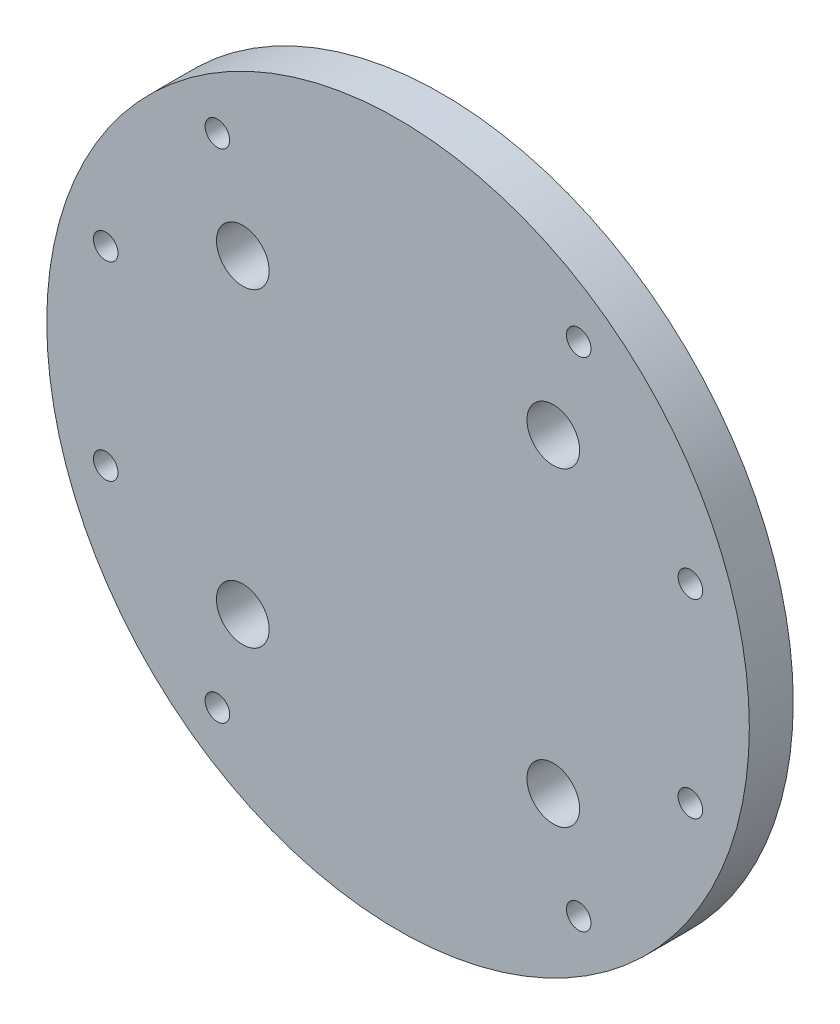
ISO-10303-21;
HEADER;
FILE_DESCRIPTION(('STEP AP214'),'2;1');
FILE_NAME('part.step','',(''),(''),'','','');
FILE_SCHEMA(('AUTOMOTIVE_DESIGN { 1 0 10303 214 1 1 1 1 }'));
ENDSEC;
DATA;
#1=APPLICATION_CONTEXT('core data for automotive mechanical design processes');
#2=APPLICATION_PROTOCOL_DEFINITION('international standard','automotive_design',2000,#1);
#3=PRODUCT_CONTEXT('',#1,'mechanical');
#4=PRODUCT('Part','Part','',(#3));
#5=PRODUCT_RELATED_PRODUCT_CATEGORY('part','',(#4));
#6=PRODUCT_DEFINITION_FORMATION('','',#4);
#7=PRODUCT_DEFINITION_CONTEXT('part definition',#1,'design');
#8=PRODUCT_DEFINITION('design','',#6,#7);
#9=PRODUCT_DEFINITION_SHAPE('','',#8);
#10=(LENGTH_UNIT() NAMED_UNIT(*) SI_UNIT(.MILLI.,.METRE.));
#11=(NAMED_UNIT(*) PLANE_ANGLE_UNIT() SI_UNIT($,.RADIAN.));
#12=(NAMED_UNIT(*) SI_UNIT($,.STERADIAN.) SOLID_ANGLE_UNIT());
#13=UNCERTAINTY_MEASURE_WITH_UNIT(LENGTH_MEASURE(1.E-05),#10,'distance_accuracy_value','');
#14=(GEOMETRIC_REPRESENTATION_CONTEXT(3) GLOBAL_UNCERTAINTY_ASSIGNED_CONTEXT((#13)) GLOBAL_UNIT_ASSIGNED_CONTEXT((#10,
#11,#12)) REPRESENTATION_CONTEXT('',''));
#15=CARTESIAN_POINT('',(0.,0.,0.));
#16=DIRECTION('',(0.,0.,1.));
#17=DIRECTION('',(1.,0.,0.));
#18=AXIS2_PLACEMENT_3D('',#15,#16,#17);
#19=CARTESIAN_POINT('',(0.,0.,5.));
#20=DIRECTION('',(0.,0.,-1.));
#21=DIRECTION('',(-1.,0.,0.));
#22=AXIS2_PLACEMENT_3D('',#19,#20,#21);
#23=CYLINDRICAL_SURFACE('',#22,40.);
#24=CARTESIAN_POINT('',(0.,0.,5.));
#25=DIRECTION('',(0.,0.,1.));
#26=DIRECTION('',(1.,0.,0.));
#27=AXIS2_PLACEMENT_3D('',#24,#25,#26);
#28=CIRCLE('',#27,40.);
#29=CARTESIAN_POINT('',(40.,0.,5.));
#30=VERTEX_POINT('',#29);
#31=EDGE_CURVE('E53',#30,#30,#28,.T.);
#32=ORIENTED_EDGE('',*,*,#31,.F.);
#33=EDGE_LOOP('',(#32));
#34=FACE_BOUND('',#33,.T.);
#35=CARTESIAN_POINT('',(0.,0.,0.));
#36=DIRECTION('',(0.,0.,1.));
#37=DIRECTION('',(1.,0.,0.));
#38=AXIS2_PLACEMENT_3D('',#35,#36,#37);
#39=CIRCLE('',#38,40.);
#40=CARTESIAN_POINT('',(40.,0.,0.));
#41=VERTEX_POINT('',#40);
#42=EDGE_CURVE('E137',#41,#41,#39,.T.);
#43=ORIENTED_EDGE('',*,*,#42,.T.);
#44=EDGE_LOOP('',(#43));
#45=FACE_BOUND('',#44,.T.);
#46=ADVANCED_FACE('F39',(#34,#45),#23,.T.);
#47=CARTESIAN_POINT('',(0.,0.,5.));
#48=DIRECTION('',(0.,0.,1.));
#49=DIRECTION('',(1.,0.,0.));
#50=AXIS2_PLACEMENT_3D('',#47,#48,#49);
#51=PLANE('',#50);
#52=CARTESIAN_POINT('',(-33.2869780703303,10.8155948031235,5.));
#53=DIRECTION('',(0.,0.,1.));
#54=DIRECTION('',(1.,0.,0.));
#55=AXIS2_PLACEMENT_3D('',#52,#53,#54);
#56=CIRCLE('',#55,1.4);
#57=CARTESIAN_POINT('',(-31.8869780703303,10.8155948031235,5.));
#58=VERTEX_POINT('',#57);
#59=EDGE_CURVE('E109',#58,#58,#56,.F.);
#60=ORIENTED_EDGE('',*,*,#59,.T.);
#61=EDGE_LOOP('',(#60));
#62=FACE_BOUND('',#61,.T.);
#63=CARTESIAN_POINT('',(-33.2869780703305,-10.8155948031228,5.));
#64=DIRECTION('',(0.,0.,1.));
#65=DIRECTION('',(1.,0.,0.));
#66=AXIS2_PLACEMENT_3D('',#63,#64,#65);
#67=CIRCLE('',#66,1.4);
#68=CARTESIAN_POINT('',(-31.8869780703305,-10.8155948031228,5.));
#69=VERTEX_POINT('',#68);
#70=EDGE_CURVE('E106',#69,#69,#67,.F.);
#71=ORIENTED_EDGE('',*,*,#70,.T.);
#72=EDGE_LOOP('',(#71));
#73=FACE_BOUND('',#72,.T.);
#74=CARTESIAN_POINT('',(-20.5724838302368,-28.315594803123,5.));
#75=DIRECTION('',(0.,0.,1.));
#76=DIRECTION('',(1.,0.,0.));
#77=AXIS2_PLACEMENT_3D('',#74,#75,#76);
#78=CIRCLE('',#77,1.4);
#79=CARTESIAN_POINT('',(-19.1724838302368,-28.315594803123,5.));
#80=VERTEX_POINT('',#79);
#81=EDGE_CURVE('E103',#80,#80,#78,.F.);
#82=ORIENTED_EDGE('',*,*,#81,.T.);
#83=EDGE_LOOP('',(#82));
#84=FACE_BOUND('',#83,.T.);
#85=CARTESIAN_POINT('',(20.5724838302364,-28.3155948031233,5.));
#86=DIRECTION('',(0.,0.,1.));
#87=DIRECTION('',(1.,0.,0.));
#88=AXIS2_PLACEMENT_3D('',#85,#86,#87);
#89=CIRCLE('',#88,1.4);
#90=CARTESIAN_POINT('',(21.9724838302364,-28.3155948031233,5.));
#91=VERTEX_POINT('',#90);
#92=EDGE_CURVE('E100',#91,#91,#89,.F.);
#93=ORIENTED_EDGE('',*,*,#92,.T.);
#94=EDGE_LOOP('',(#93));
#95=FACE_BOUND('',#94,.T.);
#96=CARTESIAN_POINT('',(33.2869780703304,-10.8155948031233,5.));
#97=DIRECTION('',(0.,0.,1.));
#98=DIRECTION('',(1.,0.,0.));
#99=AXIS2_PLACEMENT_3D('',#96,#97,#98);
#100=CIRCLE('',#99,1.4);
#101=CARTESIAN_POINT('',(34.6869780703304,-10.8155948031233,5.));
#102=VERTEX_POINT('',#101);
#103=EDGE_CURVE('E97',#102,#102,#100,.F.);
#104=ORIENTED_EDGE('',*,*,#103,.T.);
#105=EDGE_LOOP('',(#104));
#106=FACE_BOUND('',#105,.T.);
#107=CARTESIAN_POINT('',(33.2869780703304,10.8155948031231,5.));
#108=DIRECTION('',(0.,0.,1.));
#109=DIRECTION('',(1.,0.,0.));
#110=AXIS2_PLACEMENT_3D('',#107,#108,#109);
#111=CIRCLE('',#110,1.4);
#112=CARTESIAN_POINT('',(34.6869780703304,10.8155948031231,5.));
#113=VERTEX_POINT('',#112);
#114=EDGE_CURVE('E89',#113,#113,#111,.F.);
#115=ORIENTED_EDGE('',*,*,#114,.T.);
#116=EDGE_LOOP('',(#115));
#117=FACE_BOUND('',#116,.T.);
#118=CARTESIAN_POINT('',(20.5724838302366,28.3155948031232,5.));
#119=DIRECTION('',(0.,0.,1.));
#120=DIRECTION('',(1.,0.,0.));
#121=AXIS2_PLACEMENT_3D('',#118,#119,#120);
#122=CIRCLE('',#121,1.4);
#123=CARTESIAN_POINT('',(21.9724838302366,28.3155948031232,5.));
#124=VERTEX_POINT('',#123);
#125=EDGE_CURVE('E84',#124,#124,#122,.F.);
#126=ORIENTED_EDGE('',*,*,#125,.T.);
#127=EDGE_LOOP('',(#126));
#128=FACE_BOUND('',#127,.T.);
#129=CARTESIAN_POINT('',(-20.5724838302362,28.3155948031234,5.));
#130=DIRECTION('',(0.,0.,1.));
#131=DIRECTION('',(1.,0.,0.));
#132=AXIS2_PLACEMENT_3D('',#129,#130,#131);
#133=CIRCLE('',#132,1.4);
#134=CARTESIAN_POINT('',(-19.1724838302362,28.3155948031234,5.));
#135=VERTEX_POINT('',#134);
#136=EDGE_CURVE('E80',#135,#135,#133,.F.);
#137=ORIENTED_EDGE('',*,*,#136,.T.);
#138=EDGE_LOOP('',(#137));
#139=FACE_BOUND('',#138,.T.);
#140=CARTESIAN_POINT('',(-17.6776695296638,-17.6776695296635,5.));
#141=DIRECTION('',(0.,0.,1.));
#142=DIRECTION('',(1.,0.,0.));
#143=AXIS2_PLACEMENT_3D('',#140,#141,#142);
#144=CIRCLE('',#143,3.);
#145=CARTESIAN_POINT('',(-14.6776695296638,-17.6776695296635,5.));
#146=VERTEX_POINT('',#145);
#147=EDGE_CURVE('E129',#146,#146,#144,.T.);
#148=ORIENTED_EDGE('',*,*,#147,.F.);
#149=EDGE_LOOP('',(#148));
#150=FACE_BOUND('',#149,.T.);
#151=CARTESIAN_POINT('',(17.6776695296636,-17.6776695296638,5.));
#152=DIRECTION('',(0.,0.,1.));
#153=DIRECTION('',(1.,0.,0.));
#154=AXIS2_PLACEMENT_3D('',#151,#152,#153);
#155=CIRCLE('',#154,3.);
#156=CARTESIAN_POINT('',(20.6776695296636,-17.6776695296638,5.));
#157=VERTEX_POINT('',#156);
#158=EDGE_CURVE('E123',#157,#157,#155,.T.);
#159=ORIENTED_EDGE('',*,*,#158,.F.);
#160=EDGE_LOOP('',(#159));
#161=FACE_BOUND('',#160,.T.);
#162=CARTESIAN_POINT('',(17.6776695296637,17.6776695296637,5.));
#163=DIRECTION('',(0.,0.,1.));
#164=DIRECTION('',(1.,0.,0.));
#165=AXIS2_PLACEMENT_3D('',#162,#163,#164);
#166=CIRCLE('',#165,3.);
#167=CARTESIAN_POINT('',(20.6776695296637,17.6776695296637,5.));
#168=VERTEX_POINT('',#167);
#169=EDGE_CURVE('E116',#168,#168,#166,.T.);
#170=ORIENTED_EDGE('',*,*,#169,.F.);
#171=EDGE_LOOP('',(#170));
#172=FACE_BOUND('',#171,.T.);
#173=CARTESIAN_POINT('',(-17.6776695296635,17.6776695296639,5.));
#174=DIRECTION('',(0.,0.,1.));
#175=DIRECTION('',(1.,0.,0.));
#176=AXIS2_PLACEMENT_3D('',#173,#174,#175);
#177=CIRCLE('',#176,3.);
#178=CARTESIAN_POINT('',(-14.6776695296635,17.6776695296639,5.));
#179=VERTEX_POINT('',#178);
#180=EDGE_CURVE('E134',#179,#179,#177,.T.);
#181=ORIENTED_EDGE('',*,*,#180,.F.);
#182=EDGE_LOOP('',(#181));
#183=FACE_BOUND('',#182,.T.);
#184=ORIENTED_EDGE('',*,*,#31,.T.);
#185=EDGE_LOOP('',(#184));
#186=FACE_BOUND('',#185,.T.);
#187=ADVANCED_FACE('F148',(#62,#73,#84,#95,#106,#117,#128,#139,#150,#161,#172,#183,#186),#51,.T.);
#188=CARTESIAN_POINT('',(0.,0.,0.));
#189=DIRECTION('',(0.,0.,1.));
#190=DIRECTION('',(1.,0.,0.));
#191=AXIS2_PLACEMENT_3D('',#188,#189,#190);
#192=PLANE('',#191);
#193=CARTESIAN_POINT('',(-33.2869780703303,10.8155948031235,0.));
#194=DIRECTION('',(0.,0.,1.));
#195=DIRECTION('',(1.,0.,0.));
#196=AXIS2_PLACEMENT_3D('',#193,#194,#195);
#197=CIRCLE('',#196,2.75);
#198=CARTESIAN_POINT('',(-30.5369780703303,10.8155948031235,0.));
#199=VERTEX_POINT('',#198);
#200=EDGE_CURVE('E579',#199,#199,#197,.T.);
#201=ORIENTED_EDGE('',*,*,#200,.T.);
#202=EDGE_LOOP('',(#201));
#203=FACE_BOUND('',#202,.T.);
#204=CARTESIAN_POINT('',(-33.2869780703305,-10.8155948031228,0.));
#205=DIRECTION('',(0.,0.,1.));
#206=DIRECTION('',(1.,0.,0.));
#207=AXIS2_PLACEMENT_3D('',#204,#205,#206);
#208=CIRCLE('',#207,2.75);
#209=CARTESIAN_POINT('',(-30.5369780703305,-10.8155948031228,0.));
#210=VERTEX_POINT('',#209);
#211=EDGE_CURVE('E597',#210,#210,#208,.T.);
#212=ORIENTED_EDGE('',*,*,#211,.T.);
#213=EDGE_LOOP('',(#212));
#214=FACE_BOUND('',#213,.T.);
#215=CARTESIAN_POINT('',(-20.5724838302368,-28.315594803123,0.));
#216=DIRECTION('',(0.,0.,1.));
#217=DIRECTION('',(1.,0.,0.));
#218=AXIS2_PLACEMENT_3D('',#215,#216,#217);
#219=CIRCLE('',#218,2.75);
#220=CARTESIAN_POINT('',(-17.8224838302368,-28.315594803123,0.));
#221=VERTEX_POINT('',#220);
#222=EDGE_CURVE('E591',#221,#221,#219,.T.);
#223=ORIENTED_EDGE('',*,*,#222,.T.);
#224=EDGE_LOOP('',(#223));
#225=FACE_BOUND('',#224,.T.);
#226=CARTESIAN_POINT('',(20.5724838302364,-28.3155948031233,0.));
#227=DIRECTION('',(0.,0.,1.));
#228=DIRECTION('',(1.,0.,0.));
#229=AXIS2_PLACEMENT_3D('',#226,#227,#228);
#230=CIRCLE('',#229,2.75);
#231=CARTESIAN_POINT('',(23.3224838302364,-28.3155948031233,0.));
#232=VERTEX_POINT('',#231);
#233=EDGE_CURVE('E584',#232,#232,#230,.T.);
#234=ORIENTED_EDGE('',*,*,#233,.T.);
#235=EDGE_LOOP('',(#234));
#236=FACE_BOUND('',#235,.T.);
#237=CARTESIAN_POINT('',(33.2869780703304,-10.8155948031233,0.));
#238=DIRECTION('',(0.,0.,1.));
#239=DIRECTION('',(1.,0.,0.));
#240=AXIS2_PLACEMENT_3D('',#237,#238,#239);
#241=CIRCLE('',#240,2.75);
#242=CARTESIAN_POINT('',(36.0369780703304,-10.8155948031233,0.));
#243=VERTEX_POINT('',#242);
#244=EDGE_CURVE('E585',#243,#243,#241,.T.);
#245=ORIENTED_EDGE('',*,*,#244,.T.);
#246=EDGE_LOOP('',(#245));
#247=FACE_BOUND('',#246,.T.);
#248=CARTESIAN_POINT('',(33.2869780703304,10.8155948031231,0.));
#249=DIRECTION('',(0.,0.,1.));
#250=DIRECTION('',(1.,0.,0.));
#251=AXIS2_PLACEMENT_3D('',#248,#249,#250);
#252=CIRCLE('',#251,2.75);
#253=CARTESIAN_POINT('',(36.0369780703304,10.8155948031231,0.));
#254=VERTEX_POINT('',#253);
#255=EDGE_CURVE('E613',#254,#254,#252,.T.);
#256=ORIENTED_EDGE('',*,*,#255,.T.);
#257=EDGE_LOOP('',(#256));
#258=FACE_BOUND('',#257,.T.);
#259=CARTESIAN_POINT('',(20.5724838302366,28.3155948031232,0.));
#260=DIRECTION('',(0.,0.,1.));
#261=DIRECTION('',(1.,0.,0.));
#262=AXIS2_PLACEMENT_3D('',#259,#260,#261);
#263=CIRCLE('',#262,2.75);
#264=CARTESIAN_POINT('',(23.3224838302366,28.3155948031232,0.));
#265=VERTEX_POINT('',#264);
#266=EDGE_CURVE('E607',#265,#265,#263,.T.);
#267=ORIENTED_EDGE('',*,*,#266,.T.);
#268=EDGE_LOOP('',(#267));
#269=FACE_BOUND('',#268,.T.);
#270=CARTESIAN_POINT('',(-20.5724838302362,28.3155948031234,0.));
#271=DIRECTION('',(0.,0.,1.));
#272=DIRECTION('',(1.,0.,0.));
#273=AXIS2_PLACEMENT_3D('',#270,#271,#272);
#274=CIRCLE('',#273,2.75);
#275=CARTESIAN_POINT('',(-17.8224838302362,28.3155948031234,0.));
#276=VERTEX_POINT('',#275);
#277=EDGE_CURVE('E92',#276,#276,#274,.T.);
#278=ORIENTED_EDGE('',*,*,#277,.T.);
#279=EDGE_LOOP('',(#278));
#280=FACE_BOUND('',#279,.T.);
#281=CARTESIAN_POINT('',(0.,0.,0.));
#282=DIRECTION('',(0.,0.,1.));
#283=DIRECTION('',(1.,0.,0.));
#284=AXIS2_PLACEMENT_3D('',#281,#282,#283);
#285=CIRCLE('',#284,15.5);
#286=CARTESIAN_POINT('',(15.5,0.,0.));
#287=VERTEX_POINT('',#286);
#288=EDGE_CURVE('E112',#287,#287,#285,.T.);
#289=ORIENTED_EDGE('',*,*,#288,.T.);
#290=EDGE_LOOP('',(#289));
#291=FACE_BOUND('',#290,.T.);
#292=CARTESIAN_POINT('',(-17.6776695296638,-17.6776695296635,0.));
#293=DIRECTION('',(0.,0.,1.));
#294=DIRECTION('',(1.,0.,0.));
#295=AXIS2_PLACEMENT_3D('',#292,#293,#294);
#296=CIRCLE('',#295,3.);
#297=CARTESIAN_POINT('',(-14.6776695296638,-17.6776695296635,0.));
#298=VERTEX_POINT('',#297);
#299=EDGE_CURVE('E115',#298,#298,#296,.T.);
#300=ORIENTED_EDGE('',*,*,#299,.T.);
#301=EDGE_LOOP('',(#300));
#302=FACE_BOUND('',#301,.T.);
#303=CARTESIAN_POINT('',(17.6776695296636,-17.6776695296638,0.));
#304=DIRECTION('',(0.,0.,1.));
#305=DIRECTION('',(1.,0.,0.));
#306=AXIS2_PLACEMENT_3D('',#303,#304,#305);
#307=CIRCLE('',#306,3.);
#308=CARTESIAN_POINT('',(20.6776695296636,-17.6776695296638,0.));
#309=VERTEX_POINT('',#308);
#310=EDGE_CURVE('E126',#309,#309,#307,.T.);
#311=ORIENTED_EDGE('',*,*,#310,.T.);
#312=EDGE_LOOP('',(#311));
#313=FACE_BOUND('',#312,.T.);
#314=CARTESIAN_POINT('',(17.6776695296637,17.6776695296637,0.));
#315=DIRECTION('',(0.,0.,1.));
#316=DIRECTION('',(1.,0.,0.));
#317=AXIS2_PLACEMENT_3D('',#314,#315,#316);
#318=CIRCLE('',#317,3.);
#319=CARTESIAN_POINT('',(20.6776695296637,17.6776695296637,0.));
#320=VERTEX_POINT('',#319);
#321=EDGE_CURVE('E120',#320,#320,#318,.T.);
#322=ORIENTED_EDGE('',*,*,#321,.T.);
#323=EDGE_LOOP('',(#322));
#324=FACE_BOUND('',#323,.T.);
#325=CARTESIAN_POINT('',(-17.6776695296635,17.6776695296639,0.));
#326=DIRECTION('',(0.,0.,1.));
#327=DIRECTION('',(1.,0.,0.));
#328=AXIS2_PLACEMENT_3D('',#325,#326,#327);
#329=CIRCLE('',#328,3.);
#330=CARTESIAN_POINT('',(-14.6776695296635,17.6776695296639,0.));
#331=VERTEX_POINT('',#330);
#332=EDGE_CURVE('E119',#331,#331,#329,.T.);
#333=ORIENTED_EDGE('',*,*,#332,.T.);
#334=EDGE_LOOP('',(#333));
#335=FACE_BOUND('',#334,.T.);
#336=ORIENTED_EDGE('',*,*,#42,.F.);
#337=EDGE_LOOP('',(#336));
#338=FACE_BOUND('',#337,.T.);
#339=ADVANCED_FACE('F145',(#203,#214,#225,#236,#247,#258,#269,#280,#291,#302,#313,#324,#335,
#338),#192,.F.);
#340=CARTESIAN_POINT('',(-17.6776695296635,17.6776695296639,5.));
#341=DIRECTION('',(0.,0.,-1.));
#342=DIRECTION('',(-1.,0.,0.));
#343=AXIS2_PLACEMENT_3D('',#340,#341,#342);
#344=CYLINDRICAL_SURFACE('',#343,3.);
#345=ORIENTED_EDGE('',*,*,#180,.T.);
#346=EDGE_LOOP('',(#345));
#347=FACE_BOUND('',#346,.T.);
#348=ORIENTED_EDGE('',*,*,#332,.F.);
#349=EDGE_LOOP('',(#348));
#350=FACE_BOUND('',#349,.T.);
#351=ADVANCED_FACE('F147',(#347,#350),#344,.F.);
#352=CARTESIAN_POINT('',(17.6776695296637,17.6776695296637,5.));
#353=DIRECTION('',(0.,0.,-1.));
#354=DIRECTION('',(-1.,0.,0.));
#355=AXIS2_PLACEMENT_3D('',#352,#353,#354);
#356=CYLINDRICAL_SURFACE('',#355,3.);
#357=ORIENTED_EDGE('',*,*,#169,.T.);
#358=EDGE_LOOP('',(#357));
#359=FACE_BOUND('',#358,.T.);
#360=ORIENTED_EDGE('',*,*,#321,.F.);
#361=EDGE_LOOP('',(#360));
#362=FACE_BOUND('',#361,.T.);
#363=ADVANCED_FACE('F155',(#359,#362),#356,.F.);
#364=CARTESIAN_POINT('',(17.6776695296636,-17.6776695296638,5.));
#365=DIRECTION('',(0.,0.,-1.));
#366=DIRECTION('',(-1.,0.,0.));
#367=AXIS2_PLACEMENT_3D('',#364,#365,#366);
#368=CYLINDRICAL_SURFACE('',#367,3.);
#369=ORIENTED_EDGE('',*,*,#158,.T.);
#370=EDGE_LOOP('',(#369));
#371=FACE_BOUND('',#370,.T.);
#372=ORIENTED_EDGE('',*,*,#310,.F.);
#373=EDGE_LOOP('',(#372));
#374=FACE_BOUND('',#373,.T.);
#375=ADVANCED_FACE('F504',(#371,#374),#368,.F.);
#376=CARTESIAN_POINT('',(-17.6776695296638,-17.6776695296635,5.));
#377=DIRECTION('',(0.,0.,-1.));
#378=DIRECTION('',(-1.,0.,0.));
#379=AXIS2_PLACEMENT_3D('',#376,#377,#378);
#380=CYLINDRICAL_SURFACE('',#379,3.);
#381=ORIENTED_EDGE('',*,*,#147,.T.);
#382=EDGE_LOOP('',(#381));
#383=FACE_BOUND('',#382,.T.);
#384=ORIENTED_EDGE('',*,*,#299,.F.);
#385=EDGE_LOOP('',(#384));
#386=FACE_BOUND('',#385,.T.);
#387=ADVANCED_FACE('F494',(#383,#386),#380,.F.);
#388=CARTESIAN_POINT('',(0.,0.,-6.));
#389=DIRECTION('',(0.,0.,1.));
#390=DIRECTION('',(1.,0.,0.));
#391=AXIS2_PLACEMENT_3D('',#388,#389,#390);
#392=CYLINDRICAL_SURFACE('',#391,15.5);
#393=CARTESIAN_POINT('',(0.,0.,-4.99999999999999));
#394=DIRECTION('',(0.,0.,1.));
#395=DIRECTION('',(1.,0.,0.));
#396=AXIS2_PLACEMENT_3D('',#393,#394,#395);
#397=CIRCLE('',#396,15.5);
#398=CARTESIAN_POINT('',(15.5,0.,-4.99999999999999));
#399=VERTEX_POINT('',#398);
#400=EDGE_CURVE('E48',#399,#399,#397,.T.);
#401=ORIENTED_EDGE('',*,*,#400,.T.);
#402=EDGE_LOOP('',(#401));
#403=FACE_BOUND('',#402,.T.);
#404=ORIENTED_EDGE('',*,*,#288,.F.);
#405=EDGE_LOOP('',(#404));
#406=FACE_BOUND('',#405,.T.);
#407=ADVANCED_FACE('F486',(#403,#406),#392,.T.);
#408=CARTESIAN_POINT('',(0.,0.,-6.));
#409=DIRECTION('',(0.,0.,1.));
#410=DIRECTION('',(1.,0.,0.));
#411=AXIS2_PLACEMENT_3D('',#408,#409,#410);
#412=PLANE('',#411);
#413=CARTESIAN_POINT('',(0.,0.,-6.));
#414=DIRECTION('',(0.,0.,1.));
#415=DIRECTION('',(1.,0.,0.));
#416=AXIS2_PLACEMENT_3D('',#413,#414,#415);
#417=CIRCLE('',#416,14.5);
#418=CARTESIAN_POINT('',(14.5,0.,-6.));
#419=VERTEX_POINT('',#418);
#420=EDGE_CURVE('E10',#419,#419,#417,.F.);
#421=ORIENTED_EDGE('',*,*,#420,.T.);
#422=EDGE_LOOP('',(#421));
#423=FACE_BOUND('',#422,.T.);
#424=ADVANCED_FACE('F478',(#423),#412,.F.);
#425=CARTESIAN_POINT('',(0.,0.,-4.99999999999999));
#426=DIRECTION('',(0.,0.,1.));
#427=DIRECTION('',(1.,0.,0.));
#428=AXIS2_PLACEMENT_3D('',#425,#426,#427);
#429=CONICAL_SURFACE('',#428,15.5,0.785398163397454);
#430=ORIENTED_EDGE('',*,*,#420,.F.);
#431=EDGE_LOOP('',(#430));
#432=FACE_BOUND('',#431,.T.);
#433=ORIENTED_EDGE('',*,*,#400,.F.);
#434=EDGE_LOOP('',(#433));
#435=FACE_BOUND('',#434,.T.);
#436=ADVANCED_FACE('F42',(#432,#435),#429,.T.);
#437=CARTESIAN_POINT('',(-20.5724838302362,28.3155948031234,7.));
#438=DIRECTION('',(0.,0.,-1.));
#439=DIRECTION('',(-1.,0.,0.));
#440=AXIS2_PLACEMENT_3D('',#437,#438,#439);
#441=CYLINDRICAL_SURFACE('',#440,1.4);
#442=CARTESIAN_POINT('',(-20.5724838302362,28.3155948031234,3.));
#443=DIRECTION('',(0.,0.,1.));
#444=DIRECTION('',(1.,0.,0.));
#445=AXIS2_PLACEMENT_3D('',#442,#443,#444);
#446=CIRCLE('',#445,1.4);
#447=CARTESIAN_POINT('',(-19.1724838302362,28.3155948031234,3.));
#448=VERTEX_POINT('',#447);
#449=EDGE_CURVE('E44',#448,#448,#446,.T.);
#450=ORIENTED_EDGE('',*,*,#449,.F.);
#451=EDGE_LOOP('',(#450));
#452=FACE_BOUND('',#451,.T.);
#453=ORIENTED_EDGE('',*,*,#136,.F.);
#454=EDGE_LOOP('',(#453));
#455=FACE_BOUND('',#454,.T.);
#456=ADVANCED_FACE('F190',(#452,#455),#441,.F.);
#457=CARTESIAN_POINT('',(20.5724838302366,28.3155948031232,7.));
#458=DIRECTION('',(0.,0.,-1.));
#459=DIRECTION('',(-1.,0.,0.));
#460=AXIS2_PLACEMENT_3D('',#457,#458,#459);
#461=CYLINDRICAL_SURFACE('',#460,1.4);
#462=CARTESIAN_POINT('',(20.5724838302366,28.3155948031232,3.));
#463=DIRECTION('',(0.,0.,1.));
#464=DIRECTION('',(1.,0.,0.));
#465=AXIS2_PLACEMENT_3D('',#462,#463,#464);
#466=CIRCLE('',#465,1.4);
#467=CARTESIAN_POINT('',(21.9724838302366,28.3155948031232,3.));
#468=VERTEX_POINT('',#467);
#469=EDGE_CURVE('E75',#468,#468,#466,.T.);
#470=ORIENTED_EDGE('',*,*,#469,.F.);
#471=EDGE_LOOP('',(#470));
#472=FACE_BOUND('',#471,.T.);
#473=ORIENTED_EDGE('',*,*,#125,.F.);
#474=EDGE_LOOP('',(#473));
#475=FACE_BOUND('',#474,.T.);
#476=ADVANCED_FACE('F195',(#472,#475),#461,.F.);
#477=CARTESIAN_POINT('',(33.2869780703304,10.8155948031231,7.));
#478=DIRECTION('',(0.,0.,-1.));
#479=DIRECTION('',(-1.,0.,0.));
#480=AXIS2_PLACEMENT_3D('',#477,#478,#479);
#481=CYLINDRICAL_SURFACE('',#480,1.4);
#482=CARTESIAN_POINT('',(33.2869780703304,10.8155948031231,3.));
#483=DIRECTION('',(0.,0.,1.));
#484=DIRECTION('',(1.,0.,0.));
#485=AXIS2_PLACEMENT_3D('',#482,#483,#484);
#486=CIRCLE('',#485,1.4);
#487=CARTESIAN_POINT('',(34.6869780703304,10.8155948031231,3.));
#488=VERTEX_POINT('',#487);
#489=EDGE_CURVE('E73',#488,#488,#486,.T.);
#490=ORIENTED_EDGE('',*,*,#489,.F.);
#491=EDGE_LOOP('',(#490));
#492=FACE_BOUND('',#491,.T.);
#493=ORIENTED_EDGE('',*,*,#114,.F.);
#494=EDGE_LOOP('',(#493));
#495=FACE_BOUND('',#494,.T.);
#496=ADVANCED_FACE('F206',(#492,#495),#481,.F.);
#497=CARTESIAN_POINT('',(33.2869780703304,-10.8155948031233,7.));
#498=DIRECTION('',(0.,0.,-1.));
#499=DIRECTION('',(-1.,0.,0.));
#500=AXIS2_PLACEMENT_3D('',#497,#498,#499);
#501=CYLINDRICAL_SURFACE('',#500,1.4);
#502=CARTESIAN_POINT('',(33.2869780703304,-10.8155948031233,3.));
#503=DIRECTION('',(0.,0.,1.));
#504=DIRECTION('',(1.,0.,0.));
#505=AXIS2_PLACEMENT_3D('',#502,#503,#504);
#506=CIRCLE('',#505,1.4);
#507=CARTESIAN_POINT('',(34.6869780703304,-10.8155948031233,3.));
#508=VERTEX_POINT('',#507);
#509=EDGE_CURVE('E70',#508,#508,#506,.T.);
#510=ORIENTED_EDGE('',*,*,#509,.F.);
#511=EDGE_LOOP('',(#510));
#512=FACE_BOUND('',#511,.T.);
#513=ORIENTED_EDGE('',*,*,#103,.F.);
#514=EDGE_LOOP('',(#513));
#515=FACE_BOUND('',#514,.T.);
#516=ADVANCED_FACE('F217',(#512,#515),#501,.F.);
#517=CARTESIAN_POINT('',(20.5724838302364,-28.3155948031233,7.));
#518=DIRECTION('',(0.,0.,-1.));
#519=DIRECTION('',(-1.,0.,0.));
#520=AXIS2_PLACEMENT_3D('',#517,#518,#519);
#521=CYLINDRICAL_SURFACE('',#520,1.4);
#522=CARTESIAN_POINT('',(20.5724838302364,-28.3155948031233,3.));
#523=DIRECTION('',(0.,0.,1.));
#524=DIRECTION('',(1.,0.,0.));
#525=AXIS2_PLACEMENT_3D('',#522,#523,#524);
#526=CIRCLE('',#525,1.4);
#527=CARTESIAN_POINT('',(21.9724838302364,-28.3155948031233,3.));
#528=VERTEX_POINT('',#527);
#529=EDGE_CURVE('E67',#528,#528,#526,.T.);
#530=ORIENTED_EDGE('',*,*,#529,.F.);
#531=EDGE_LOOP('',(#530));
#532=FACE_BOUND('',#531,.T.);
#533=ORIENTED_EDGE('',*,*,#92,.F.);
#534=EDGE_LOOP('',(#533));
#535=FACE_BOUND('',#534,.T.);
#536=ADVANCED_FACE('F228',(#532,#535),#521,.F.);
#537=CARTESIAN_POINT('',(-20.5724838302368,-28.315594803123,7.));
#538=DIRECTION('',(0.,0.,-1.));
#539=DIRECTION('',(-1.,0.,0.));
#540=AXIS2_PLACEMENT_3D('',#537,#538,#539);
#541=CYLINDRICAL_SURFACE('',#540,1.4);
#542=CARTESIAN_POINT('',(-20.5724838302368,-28.315594803123,3.));
#543=DIRECTION('',(0.,0.,1.));
#544=DIRECTION('',(1.,0.,0.));
#545=AXIS2_PLACEMENT_3D('',#542,#543,#544);
#546=CIRCLE('',#545,1.4);
#547=CARTESIAN_POINT('',(-19.1724838302368,-28.315594803123,3.));
#548=VERTEX_POINT('',#547);
#549=EDGE_CURVE('E64',#548,#548,#546,.T.);
#550=ORIENTED_EDGE('',*,*,#549,.F.);
#551=EDGE_LOOP('',(#550));
#552=FACE_BOUND('',#551,.T.);
#553=ORIENTED_EDGE('',*,*,#81,.F.);
#554=EDGE_LOOP('',(#553));
#555=FACE_BOUND('',#554,.T.);
#556=ADVANCED_FACE('F239',(#552,#555),#541,.F.);
#557=CARTESIAN_POINT('',(-33.2869780703305,-10.8155948031228,7.));
#558=DIRECTION('',(0.,0.,-1.));
#559=DIRECTION('',(-1.,0.,0.));
#560=AXIS2_PLACEMENT_3D('',#557,#558,#559);
#561=CYLINDRICAL_SURFACE('',#560,1.4);
#562=CARTESIAN_POINT('',(-33.2869780703305,-10.8155948031228,3.));
#563=DIRECTION('',(0.,0.,1.));
#564=DIRECTION('',(1.,0.,0.));
#565=AXIS2_PLACEMENT_3D('',#562,#563,#564);
#566=CIRCLE('',#565,1.4);
#567=CARTESIAN_POINT('',(-31.8869780703305,-10.8155948031228,3.));
#568=VERTEX_POINT('',#567);
#569=EDGE_CURVE('E60',#568,#568,#566,.T.);
#570=ORIENTED_EDGE('',*,*,#569,.F.);
#571=EDGE_LOOP('',(#570));
#572=FACE_BOUND('',#571,.T.);
#573=ORIENTED_EDGE('',*,*,#70,.F.);
#574=EDGE_LOOP('',(#573));
#575=FACE_BOUND('',#574,.T.);
#576=ADVANCED_FACE('F250',(#572,#575),#561,.F.);
#577=CARTESIAN_POINT('',(-33.2869780703303,10.8155948031235,7.));
#578=DIRECTION('',(0.,0.,-1.));
#579=DIRECTION('',(-1.,0.,0.));
#580=AXIS2_PLACEMENT_3D('',#577,#578,#579);
#581=CYLINDRICAL_SURFACE('',#580,1.4);
#582=CARTESIAN_POINT('',(-33.2869780703303,10.8155948031235,3.));
#583=DIRECTION('',(0.,0.,1.));
#584=DIRECTION('',(1.,0.,0.));
#585=AXIS2_PLACEMENT_3D('',#582,#583,#584);
#586=CIRCLE('',#585,1.4);
#587=CARTESIAN_POINT('',(-31.8869780703303,10.8155948031235,3.));
#588=VERTEX_POINT('',#587);
#589=EDGE_CURVE('E57',#588,#588,#586,.T.);
#590=ORIENTED_EDGE('',*,*,#589,.F.);
#591=EDGE_LOOP('',(#590));
#592=FACE_BOUND('',#591,.T.);
#593=ORIENTED_EDGE('',*,*,#59,.F.);
#594=EDGE_LOOP('',(#593));
#595=FACE_BOUND('',#594,.T.);
#596=ADVANCED_FACE('F261',(#592,#595),#581,.F.);
#597=CARTESIAN_POINT('',(-33.2869780703303,10.8155948031235,3.));
#598=DIRECTION('',(0.,0.,-1.));
#599=DIRECTION('',(-1.,0.,0.));
#600=AXIS2_PLACEMENT_3D('',#597,#598,#599);
#601=CYLINDRICAL_SURFACE('',#600,2.75);
#602=CARTESIAN_POINT('',(-33.2869780703303,10.8155948031235,3.));
#603=DIRECTION('',(0.,0.,1.));
#604=DIRECTION('',(1.,0.,0.));
#605=AXIS2_PLACEMENT_3D('',#602,#603,#604);
#606=CIRCLE('',#605,2.75);
#607=CARTESIAN_POINT('',(-30.5369780703303,10.8155948031235,3.));
#608=VERTEX_POINT('',#607);
#609=EDGE_CURVE('E600',#608,#608,#606,.T.);
#610=ORIENTED_EDGE('',*,*,#609,.T.);
#611=EDGE_LOOP('',(#610));
#612=FACE_BOUND('',#611,.T.);
#613=ORIENTED_EDGE('',*,*,#200,.F.);
#614=EDGE_LOOP('',(#613));
#615=FACE_BOUND('',#614,.T.);
#616=ADVANCED_FACE('F272',(#612,#615),#601,.F.);
#617=CARTESIAN_POINT('',(-33.2869780703303,10.8155948031235,3.));
#618=DIRECTION('',(0.,0.,1.));
#619=DIRECTION('',(1.,0.,0.));
#620=AXIS2_PLACEMENT_3D('',#617,#618,#619);
#621=PLANE('',#620);
#622=ORIENTED_EDGE('',*,*,#589,.T.);
#623=EDGE_LOOP('',(#622));
#624=FACE_BOUND('',#623,.T.);
#625=ORIENTED_EDGE('',*,*,#609,.F.);
#626=EDGE_LOOP('',(#625));
#627=FACE_BOUND('',#626,.T.);
#628=ADVANCED_FACE('F283',(#624,#627),#621,.F.);
#629=CARTESIAN_POINT('',(-33.2869780703305,-10.8155948031228,3.));
#630=DIRECTION('',(0.,0.,-1.));
#631=DIRECTION('',(-1.,0.,0.));
#632=AXIS2_PLACEMENT_3D('',#629,#630,#631);
#633=CYLINDRICAL_SURFACE('',#632,2.75);
#634=CARTESIAN_POINT('',(-33.2869780703305,-10.8155948031228,3.));
#635=DIRECTION('',(0.,0.,1.));
#636=DIRECTION('',(1.,0.,0.));
#637=AXIS2_PLACEMENT_3D('',#634,#635,#636);
#638=CIRCLE('',#637,2.75);
#639=CARTESIAN_POINT('',(-30.5369780703305,-10.8155948031228,3.));
#640=VERTEX_POINT('',#639);
#641=EDGE_CURVE('E594',#640,#640,#638,.T.);
#642=ORIENTED_EDGE('',*,*,#641,.T.);
#643=EDGE_LOOP('',(#642));
#644=FACE_BOUND('',#643,.T.);
#645=ORIENTED_EDGE('',*,*,#211,.F.);
#646=EDGE_LOOP('',(#645));
#647=FACE_BOUND('',#646,.T.);
#648=ADVANCED_FACE('F294',(#644,#647),#633,.F.);
#649=CARTESIAN_POINT('',(-33.2869780703305,-10.8155948031228,3.));
#650=DIRECTION('',(0.,0.,1.));
#651=DIRECTION('',(1.,0.,0.));
#652=AXIS2_PLACEMENT_3D('',#649,#650,#651);
#653=PLANE('',#652);
#654=ORIENTED_EDGE('',*,*,#569,.T.);
#655=EDGE_LOOP('',(#654));
#656=FACE_BOUND('',#655,.T.);
#657=ORIENTED_EDGE('',*,*,#641,.F.);
#658=EDGE_LOOP('',(#657));
#659=FACE_BOUND('',#658,.T.);
#660=ADVANCED_FACE('F305',(#656,#659),#653,.F.);
#661=CARTESIAN_POINT('',(-20.5724838302368,-28.315594803123,3.));
#662=DIRECTION('',(0.,0.,-1.));
#663=DIRECTION('',(-1.,0.,0.));
#664=AXIS2_PLACEMENT_3D('',#661,#662,#663);
#665=CYLINDRICAL_SURFACE('',#664,2.75);
#666=CARTESIAN_POINT('',(-20.5724838302368,-28.315594803123,3.));
#667=DIRECTION('',(0.,0.,1.));
#668=DIRECTION('',(1.,0.,0.));
#669=AXIS2_PLACEMENT_3D('',#666,#667,#668);
#670=CIRCLE('',#669,2.75);
#671=CARTESIAN_POINT('',(-17.8224838302368,-28.315594803123,3.));
#672=VERTEX_POINT('',#671);
#673=EDGE_CURVE('E588',#672,#672,#670,.T.);
#674=ORIENTED_EDGE('',*,*,#673,.T.);
#675=EDGE_LOOP('',(#674));
#676=FACE_BOUND('',#675,.T.);
#677=ORIENTED_EDGE('',*,*,#222,.F.);
#678=EDGE_LOOP('',(#677));
#679=FACE_BOUND('',#678,.T.);
#680=ADVANCED_FACE('F316',(#676,#679),#665,.F.);
#681=CARTESIAN_POINT('',(-20.5724838302368,-28.315594803123,3.));
#682=DIRECTION('',(0.,0.,1.));
#683=DIRECTION('',(1.,0.,0.));
#684=AXIS2_PLACEMENT_3D('',#681,#682,#683);
#685=PLANE('',#684);
#686=ORIENTED_EDGE('',*,*,#549,.T.);
#687=EDGE_LOOP('',(#686));
#688=FACE_BOUND('',#687,.T.);
#689=ORIENTED_EDGE('',*,*,#673,.F.);
#690=EDGE_LOOP('',(#689));
#691=FACE_BOUND('',#690,.T.);
#692=ADVANCED_FACE('F327',(#688,#691),#685,.F.);
#693=CARTESIAN_POINT('',(20.5724838302364,-28.3155948031233,3.));
#694=DIRECTION('',(0.,0.,-1.));
#695=DIRECTION('',(-1.,0.,0.));
#696=AXIS2_PLACEMENT_3D('',#693,#694,#695);
#697=CYLINDRICAL_SURFACE('',#696,2.75);
#698=CARTESIAN_POINT('',(20.5724838302364,-28.3155948031233,3.));
#699=DIRECTION('',(0.,0.,1.));
#700=DIRECTION('',(1.,0.,0.));
#701=AXIS2_PLACEMENT_3D('',#698,#699,#700);
#702=CIRCLE('',#701,2.75);
#703=CARTESIAN_POINT('',(23.3224838302364,-28.3155948031233,3.));
#704=VERTEX_POINT('',#703);
#705=EDGE_CURVE('E581',#704,#704,#702,.T.);
#706=ORIENTED_EDGE('',*,*,#705,.T.);
#707=EDGE_LOOP('',(#706));
#708=FACE_BOUND('',#707,.T.);
#709=ORIENTED_EDGE('',*,*,#233,.F.);
#710=EDGE_LOOP('',(#709));
#711=FACE_BOUND('',#710,.T.);
#712=ADVANCED_FACE('F338',(#708,#711),#697,.F.);
#713=CARTESIAN_POINT('',(20.5724838302364,-28.3155948031233,3.));
#714=DIRECTION('',(0.,0.,1.));
#715=DIRECTION('',(1.,0.,0.));
#716=AXIS2_PLACEMENT_3D('',#713,#714,#715);
#717=PLANE('',#716);
#718=ORIENTED_EDGE('',*,*,#529,.T.);
#719=EDGE_LOOP('',(#718));
#720=FACE_BOUND('',#719,.T.);
#721=ORIENTED_EDGE('',*,*,#705,.F.);
#722=EDGE_LOOP('',(#721));
#723=FACE_BOUND('',#722,.T.);
#724=ADVANCED_FACE('F349',(#720,#723),#717,.F.);
#725=CARTESIAN_POINT('',(33.2869780703304,-10.8155948031233,3.));
#726=DIRECTION('',(0.,0.,-1.));
#727=DIRECTION('',(-1.,0.,0.));
#728=AXIS2_PLACEMENT_3D('',#725,#726,#727);
#729=CYLINDRICAL_SURFACE('',#728,2.75);
#730=CARTESIAN_POINT('',(33.2869780703304,-10.8155948031233,3.));
#731=DIRECTION('',(0.,0.,1.));
#732=DIRECTION('',(1.,0.,0.));
#733=AXIS2_PLACEMENT_3D('',#730,#731,#732);
#734=CIRCLE('',#733,2.75);
#735=CARTESIAN_POINT('',(36.0369780703304,-10.8155948031233,3.));
#736=VERTEX_POINT('',#735);
#737=EDGE_CURVE('E616',#736,#736,#734,.T.);
#738=ORIENTED_EDGE('',*,*,#737,.T.);
#739=EDGE_LOOP('',(#738));
#740=FACE_BOUND('',#739,.T.);
#741=ORIENTED_EDGE('',*,*,#244,.F.);
#742=EDGE_LOOP('',(#741));
#743=FACE_BOUND('',#742,.T.);
#744=ADVANCED_FACE('F360',(#740,#743),#729,.F.);
#745=CARTESIAN_POINT('',(33.2869780703304,-10.8155948031233,3.));
#746=DIRECTION('',(0.,0.,1.));
#747=DIRECTION('',(1.,0.,0.));
#748=AXIS2_PLACEMENT_3D('',#745,#746,#747);
#749=PLANE('',#748);
#750=ORIENTED_EDGE('',*,*,#509,.T.);
#751=EDGE_LOOP('',(#750));
#752=FACE_BOUND('',#751,.T.);
#753=ORIENTED_EDGE('',*,*,#737,.F.);
#754=EDGE_LOOP('',(#753));
#755=FACE_BOUND('',#754,.T.);
#756=ADVANCED_FACE('F371',(#752,#755),#749,.F.);
#757=CARTESIAN_POINT('',(33.2869780703304,10.8155948031231,3.));
#758=DIRECTION('',(0.,0.,-1.));
#759=DIRECTION('',(-1.,0.,0.));
#760=AXIS2_PLACEMENT_3D('',#757,#758,#759);
#761=CYLINDRICAL_SURFACE('',#760,2.75);
#762=CARTESIAN_POINT('',(33.2869780703304,10.8155948031231,3.));
#763=DIRECTION('',(0.,0.,1.));
#764=DIRECTION('',(1.,0.,0.));
#765=AXIS2_PLACEMENT_3D('',#762,#763,#764);
#766=CIRCLE('',#765,2.75);
#767=CARTESIAN_POINT('',(36.0369780703304,10.8155948031231,3.));
#768=VERTEX_POINT('',#767);
#769=EDGE_CURVE('E610',#768,#768,#766,.T.);
#770=ORIENTED_EDGE('',*,*,#769,.T.);
#771=EDGE_LOOP('',(#770));
#772=FACE_BOUND('',#771,.T.);
#773=ORIENTED_EDGE('',*,*,#255,.F.);
#774=EDGE_LOOP('',(#773));
#775=FACE_BOUND('',#774,.T.);
#776=ADVANCED_FACE('F382',(#772,#775),#761,.F.);
#777=CARTESIAN_POINT('',(33.2869780703304,10.8155948031231,3.));
#778=DIRECTION('',(0.,0.,1.));
#779=DIRECTION('',(1.,0.,0.));
#780=AXIS2_PLACEMENT_3D('',#777,#778,#779);
#781=PLANE('',#780);
#782=ORIENTED_EDGE('',*,*,#489,.T.);
#783=EDGE_LOOP('',(#782));
#784=FACE_BOUND('',#783,.T.);
#785=ORIENTED_EDGE('',*,*,#769,.F.);
#786=EDGE_LOOP('',(#785));
#787=FACE_BOUND('',#786,.T.);
#788=ADVANCED_FACE('F393',(#784,#787),#781,.F.);
#789=CARTESIAN_POINT('',(20.5724838302366,28.3155948031232,3.));
#790=DIRECTION('',(0.,0.,-1.));
#791=DIRECTION('',(-1.,0.,0.));
#792=AXIS2_PLACEMENT_3D('',#789,#790,#791);
#793=CYLINDRICAL_SURFACE('',#792,2.75);
#794=CARTESIAN_POINT('',(20.5724838302366,28.3155948031232,3.));
#795=DIRECTION('',(0.,0.,1.));
#796=DIRECTION('',(1.,0.,0.));
#797=AXIS2_PLACEMENT_3D('',#794,#795,#796);
#798=CIRCLE('',#797,2.75);
#799=CARTESIAN_POINT('',(23.3224838302366,28.3155948031232,3.));
#800=VERTEX_POINT('',#799);
#801=EDGE_CURVE('E604',#800,#800,#798,.T.);
#802=ORIENTED_EDGE('',*,*,#801,.T.);
#803=EDGE_LOOP('',(#802));
#804=FACE_BOUND('',#803,.T.);
#805=ORIENTED_EDGE('',*,*,#266,.F.);
#806=EDGE_LOOP('',(#805));
#807=FACE_BOUND('',#806,.T.);
#808=ADVANCED_FACE('F404',(#804,#807),#793,.F.);
#809=CARTESIAN_POINT('',(20.5724838302366,28.3155948031232,3.));
#810=DIRECTION('',(0.,0.,1.));
#811=DIRECTION('',(1.,0.,0.));
#812=AXIS2_PLACEMENT_3D('',#809,#810,#811);
#813=PLANE('',#812);
#814=ORIENTED_EDGE('',*,*,#469,.T.);
#815=EDGE_LOOP('',(#814));
#816=FACE_BOUND('',#815,.T.);
#817=ORIENTED_EDGE('',*,*,#801,.F.);
#818=EDGE_LOOP('',(#817));
#819=FACE_BOUND('',#818,.T.);
#820=ADVANCED_FACE('F415',(#816,#819),#813,.F.);
#821=CARTESIAN_POINT('',(-20.5724838302362,28.3155948031234,3.));
#822=DIRECTION('',(0.,0.,-1.));
#823=DIRECTION('',(-1.,0.,0.));
#824=AXIS2_PLACEMENT_3D('',#821,#822,#823);
#825=CYLINDRICAL_SURFACE('',#824,2.75);
#826=CARTESIAN_POINT('',(-20.5724838302362,28.3155948031234,3.));
#827=DIRECTION('',(0.,0.,1.));
#828=DIRECTION('',(1.,0.,0.));
#829=AXIS2_PLACEMENT_3D('',#826,#827,#828);
#830=CIRCLE('',#829,2.75);
#831=CARTESIAN_POINT('',(-17.8224838302362,28.3155948031234,3.));
#832=VERTEX_POINT('',#831);
#833=EDGE_CURVE('E61',#832,#832,#830,.T.);
#834=ORIENTED_EDGE('',*,*,#833,.T.);
#835=EDGE_LOOP('',(#834));
#836=FACE_BOUND('',#835,.T.);
#837=ORIENTED_EDGE('',*,*,#277,.F.);
#838=EDGE_LOOP('',(#837));
#839=FACE_BOUND('',#838,.T.);
#840=ADVANCED_FACE('F426',(#836,#839),#825,.F.);
#841=CARTESIAN_POINT('',(-20.5724838302362,28.3155948031234,3.));
#842=DIRECTION('',(0.,0.,1.));
#843=DIRECTION('',(1.,0.,0.));
#844=AXIS2_PLACEMENT_3D('',#841,#842,#843);
#845=PLANE('',#844);
#846=ORIENTED_EDGE('',*,*,#449,.T.);
#847=EDGE_LOOP('',(#846));
#848=FACE_BOUND('',#847,.T.);
#849=ORIENTED_EDGE('',*,*,#833,.F.);
#850=EDGE_LOOP('',(#849));
#851=FACE_BOUND('',#850,.T.);
#852=ADVANCED_FACE('F436',(#848,#851),#845,.F.);
#853=CLOSED_SHELL('',(#46,#187,#339,#351,#363,#375,#387,#407,#424,#436,#456,#476,#496,#516,#536,
#556,#576,#596,#616,#628,#648,#660,#680,#692,#712,#724,#744,#756,#776,#788,#808,#820,#840,#852));
#854=MANIFOLD_SOLID_BREP('B2',#853);
#855=ADVANCED_BREP_SHAPE_REPRESENTATION('',(#18,#854),#14);
#856=SHAPE_DEFINITION_REPRESENTATION(#9,#855);
ENDSEC;
END-ISO-10303-21;
